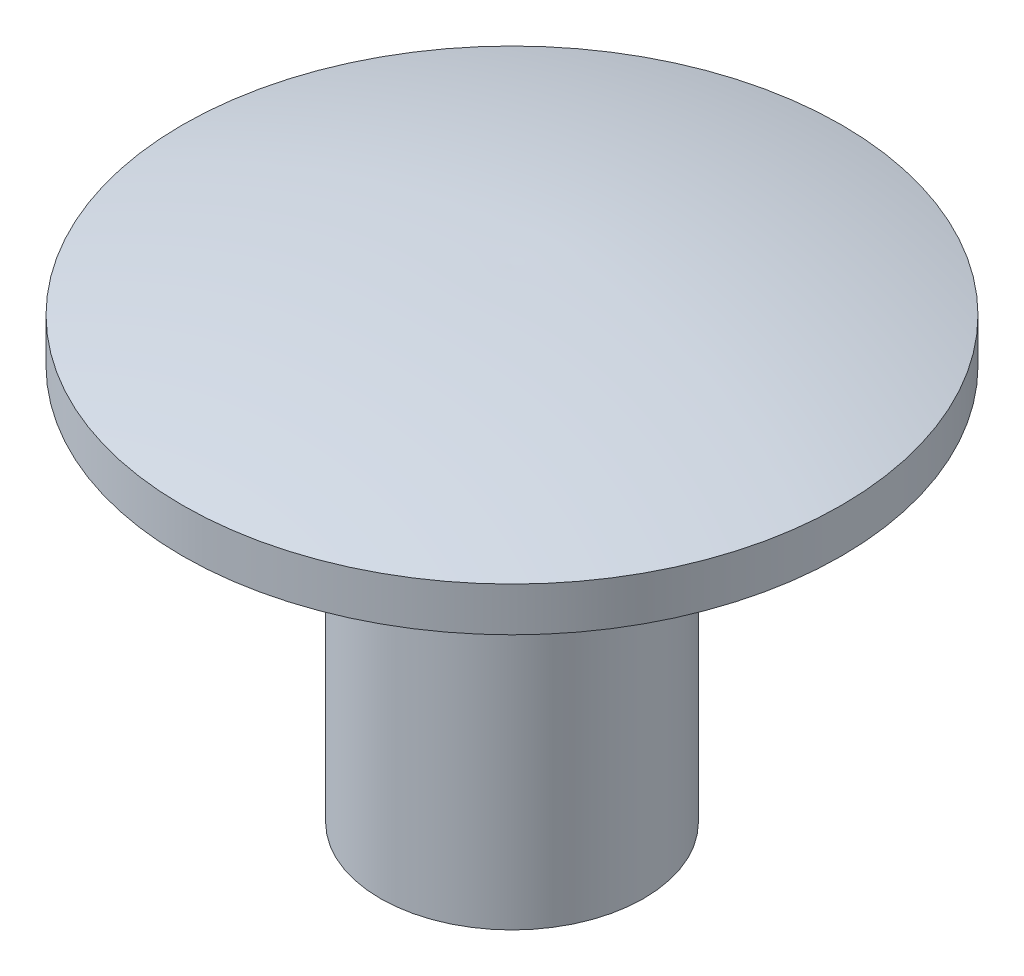
ISO-10303-21;
HEADER;
FILE_DESCRIPTION(('STEP AP214'),'2;1');
FILE_NAME('part.step','',(''),(''),'','','');
FILE_SCHEMA(('AUTOMOTIVE_DESIGN { 1 0 10303 214 1 1 1 1 }'));
ENDSEC;
DATA;
#1=APPLICATION_CONTEXT('core data for automotive mechanical design processes');
#2=APPLICATION_PROTOCOL_DEFINITION('international standard','automotive_design',2000,#1);
#3=PRODUCT_CONTEXT('',#1,'mechanical');
#4=PRODUCT('Part','Part','',(#3));
#5=PRODUCT_RELATED_PRODUCT_CATEGORY('part','',(#4));
#6=PRODUCT_DEFINITION_FORMATION('','',#4);
#7=PRODUCT_DEFINITION_CONTEXT('part definition',#1,'design');
#8=PRODUCT_DEFINITION('design','',#6,#7);
#9=PRODUCT_DEFINITION_SHAPE('','',#8);
#10=(LENGTH_UNIT() NAMED_UNIT(*) SI_UNIT(.MILLI.,.METRE.));
#11=(NAMED_UNIT(*) PLANE_ANGLE_UNIT() SI_UNIT($,.RADIAN.));
#12=(NAMED_UNIT(*) SI_UNIT($,.STERADIAN.) SOLID_ANGLE_UNIT());
#13=UNCERTAINTY_MEASURE_WITH_UNIT(LENGTH_MEASURE(1.E-05),#10,'distance_accuracy_value','');
#14=(GEOMETRIC_REPRESENTATION_CONTEXT(3) GLOBAL_UNCERTAINTY_ASSIGNED_CONTEXT((#13)) GLOBAL_UNIT_ASSIGNED_CONTEXT((#10,
#11,#12)) REPRESENTATION_CONTEXT('',''));
#15=CARTESIAN_POINT('',(0.,0.,0.));
#16=DIRECTION('',(0.,0.,1.));
#17=DIRECTION('',(1.,0.,0.));
#18=AXIS2_PLACEMENT_3D('',#15,#16,#17);
#19=CARTESIAN_POINT('',(0.,-2.,1.11022302462516E-13));
#20=DIRECTION('',(0.,-1.,0.));
#21=DIRECTION('',(0.,0.,-1.));
#22=AXIS2_PLACEMENT_3D('',#19,#20,#21);
#23=PLANE('',#22);
#24=CARTESIAN_POINT('',(0.,-2.,1.11022302462516E-13));
#25=DIRECTION('',(0.,-1.,0.));
#26=DIRECTION('',(0.,0.,-1.));
#27=AXIS2_PLACEMENT_3D('',#24,#25,#26);
#28=CIRCLE('',#27,3.);
#29=CARTESIAN_POINT('',(0.,-2.,-2.99999999999984));
#30=VERTEX_POINT('',#29);
#31=CARTESIAN_POINT('',(3.00000000000003,-2.,1.66533453693773E-13));
#32=VERTEX_POINT('',#31);
#33=EDGE_CURVE('E53',#30,#32,#28,.T.);
#34=ORIENTED_EDGE('',*,*,#33,.F.);
#35=DIRECTION('',(1.,0.,0.));
#36=VECTOR('',#35,1.);
#37=CARTESIAN_POINT('',(-2.99999999999992,-2.,-2.99999999999989));
#38=LINE('',#37,#36);
#39=CARTESIAN_POINT('',(3.00000000000006,-2.,-2.99999999999989));
#40=VERTEX_POINT('',#39);
#41=EDGE_CURVE('E133',#30,#40,#38,.T.);
#42=ORIENTED_EDGE('',*,*,#41,.T.);
#43=DIRECTION('',(0.,0.,1.));
#44=VECTOR('',#43,1.);
#45=CARTESIAN_POINT('',(3.00000000000009,-2.,3.00000000000006));
#46=LINE('',#45,#44);
#47=EDGE_CURVE('E122',#40,#32,#46,.T.);
#48=ORIENTED_EDGE('',*,*,#47,.T.);
#49=EDGE_LOOP('',(#34,#42,#48));
#50=FACE_BOUND('',#49,.T.);
#51=ADVANCED_FACE('F42',(#50),#23,.T.);
#52=CARTESIAN_POINT('',(0.,-2.,3.00000000000011));
#53=VERTEX_POINT('',#52);
#54=EDGE_CURVE('E11',#32,#53,#28,.T.);
#55=ORIENTED_EDGE('',*,*,#54,.F.);
#56=CARTESIAN_POINT('',(3.00000000000009,-2.,3.00000000000006));
#57=VERTEX_POINT('',#56);
#58=EDGE_CURVE('E126',#32,#57,#46,.T.);
#59=ORIENTED_EDGE('',*,*,#58,.T.);
#60=DIRECTION('',(-1.,0.,0.));
#61=VECTOR('',#60,1.);
#62=CARTESIAN_POINT('',(-2.99999999999998,-2.,3.00000000000006));
#63=LINE('',#62,#61);
#64=EDGE_CURVE('E127',#57,#53,#63,.T.);
#65=ORIENTED_EDGE('',*,*,#64,.T.);
#66=EDGE_LOOP('',(#55,#59,#65));
#67=FACE_BOUND('',#66,.T.);
#68=ADVANCED_FACE('F182',(#67),#23,.T.);
#69=CARTESIAN_POINT('',(-2.99999999999998,-2.,1.11022302462516E-13));
#70=VERTEX_POINT('',#69);
#71=EDGE_CURVE('E51',#53,#70,#28,.T.);
#72=ORIENTED_EDGE('',*,*,#71,.F.);
#73=CARTESIAN_POINT('',(-2.99999999999998,-2.,3.00000000000006));
#74=VERTEX_POINT('',#73);
#75=EDGE_CURVE('E125',#53,#74,#63,.T.);
#76=ORIENTED_EDGE('',*,*,#75,.T.);
#77=DIRECTION('',(0.,0.,-1.));
#78=VECTOR('',#77,1.);
#79=CARTESIAN_POINT('',(-2.99999999999998,-2.,3.00000000000006));
#80=LINE('',#79,#78);
#81=EDGE_CURVE('E131',#74,#70,#80,.T.);
#82=ORIENTED_EDGE('',*,*,#81,.T.);
#83=EDGE_LOOP('',(#72,#76,#82));
#84=FACE_BOUND('',#83,.T.);
#85=ADVANCED_FACE('F175',(#84),#23,.T.);
#86=CARTESIAN_POINT('',(0.,0.,0.));
#87=DIRECTION('',(0.,1.,0.));
#88=DIRECTION('',(0.,0.,1.));
#89=AXIS2_PLACEMENT_3D('',#86,#87,#88);
#90=PLANE('',#89);
#91=CARTESIAN_POINT('',(0.,0.,0.));
#92=DIRECTION('',(0.,1.,0.));
#93=DIRECTION('',(0.,0.,1.));
#94=AXIS2_PLACEMENT_3D('',#91,#92,#93);
#95=CIRCLE('',#94,7.5);
#96=CARTESIAN_POINT('',(0.,0.,7.5));
#97=VERTEX_POINT('',#96);
#98=EDGE_CURVE('E46',#97,#97,#95,.T.);
#99=ORIENTED_EDGE('',*,*,#98,.F.);
#100=EDGE_LOOP('',(#99));
#101=FACE_BOUND('',#100,.T.);
#102=DIRECTION('',(0.,0.,1.));
#103=VECTOR('',#102,1.);
#104=CARTESIAN_POINT('',(2.99999999999995,0.,3.00000000000006));
#105=LINE('',#104,#103);
#106=CARTESIAN_POINT('',(3.00000000000003,0.,-3.));
#107=VERTEX_POINT('',#106);
#108=CARTESIAN_POINT('',(2.99999999999995,0.,3.00000000000006));
#109=VERTEX_POINT('',#108);
#110=EDGE_CURVE('E120',#107,#109,#105,.T.);
#111=ORIENTED_EDGE('',*,*,#110,.F.);
#112=DIRECTION('',(1.,0.,0.));
#113=VECTOR('',#112,1.);
#114=CARTESIAN_POINT('',(-3.00000000000006,0.,-2.99999999999989));
#115=LINE('',#114,#113);
#116=CARTESIAN_POINT('',(-3.00000000000006,0.,-2.99999999999989));
#117=VERTEX_POINT('',#116);
#118=EDGE_CURVE('E145',#117,#107,#115,.T.);
#119=ORIENTED_EDGE('',*,*,#118,.F.);
#120=DIRECTION('',(0.,0.,-1.));
#121=VECTOR('',#120,1.);
#122=CARTESIAN_POINT('',(-3.00000000000009,0.,3.));
#123=LINE('',#122,#121);
#124=CARTESIAN_POINT('',(-3.00000000000009,0.,3.));
#125=VERTEX_POINT('',#124);
#126=EDGE_CURVE('E142',#125,#117,#123,.T.);
#127=ORIENTED_EDGE('',*,*,#126,.F.);
#128=DIRECTION('',(-1.,0.,0.));
#129=VECTOR('',#128,1.);
#130=CARTESIAN_POINT('',(-3.00000000000009,0.,3.));
#131=LINE('',#130,#129);
#132=EDGE_CURVE('E139',#109,#125,#131,.T.);
#133=ORIENTED_EDGE('',*,*,#132,.F.);
#134=EDGE_LOOP('',(#111,#119,#127,#133));
#135=FACE_BOUND('',#134,.T.);
#136=ADVANCED_FACE('F173',(#101,#135),#90,.F.);
#137=CARTESIAN_POINT('',(0.,1.,0.));
#138=DIRECTION('',(0.,-1.,0.));
#139=DIRECTION('',(0.,0.,-1.));
#140=AXIS2_PLACEMENT_3D('',#137,#138,#139);
#141=CYLINDRICAL_SURFACE('',#140,7.5);
#142=CARTESIAN_POINT('',(0.,1.,0.));
#143=DIRECTION('',(0.,1.,0.));
#144=DIRECTION('',(0.,0.,1.));
#145=AXIS2_PLACEMENT_3D('',#142,#143,#144);
#146=CIRCLE('',#145,7.5);
#147=CARTESIAN_POINT('',(0.,1.,7.49999999999994));
#148=VERTEX_POINT('',#147);
#149=EDGE_CURVE('E162',#148,#148,#146,.T.);
#150=ORIENTED_EDGE('',*,*,#149,.F.);
#151=EDGE_LOOP('',(#150));
#152=FACE_BOUND('',#151,.T.);
#153=ORIENTED_EDGE('',*,*,#98,.T.);
#154=EDGE_LOOP('',(#153));
#155=FACE_BOUND('',#154,.T.);
#156=ADVANCED_FACE('F44',(#152,#155),#141,.T.);
#157=CARTESIAN_POINT('',(7.50000000000006,1.,0.));
#158=CARTESIAN_POINT('',(3.82280275613323,2.04760619589786,0.));
#159=CARTESIAN_POINT('',(0.,2.,0.));
#160=B_SPLINE_CURVE_WITH_KNOTS('',2,(#157,#158,#159),.UNSPECIFIED.,.F.,.F.,(3,3),(0.,1.),.UNSPECIFIED.);
#161=CARTESIAN_POINT('',(0.,1.,0.));
#162=DIRECTION('',(0.,-1.,0.));
#163=AXIS1_PLACEMENT('',#161,#162);
#164=SURFACE_OF_REVOLUTION('',#160,#163);
#165=CARTESIAN_POINT('',(0.,2.,0.));
#166=VERTEX_POINT('',#165);
#167=VERTEX_LOOP('',#166);
#168=FACE_BOUND('',#167,.T.);
#169=ORIENTED_EDGE('',*,*,#149,.T.);
#170=EDGE_LOOP('',(#169));
#171=FACE_BOUND('',#170,.T.);
#172=ADVANCED_FACE('F167',(#168,#171),#164,.F.);
#173=CARTESIAN_POINT('',(3.00000000000009,-2.,3.00000000000006));
#174=DIRECTION('',(-1.,0.,0.));
#175=DIRECTION('',(0.,0.,1.));
#176=AXIS2_PLACEMENT_3D('',#173,#174,#175);
#177=PLANE('',#176);
#178=ORIENTED_EDGE('',*,*,#110,.T.);
#179=DIRECTION('',(0.,1.,0.));
#180=VECTOR('',#179,1.);
#181=CARTESIAN_POINT('',(3.00000000000009,-2.,3.00000000000006));
#182=LINE('',#181,#180);
#183=EDGE_CURVE('E156',#57,#109,#182,.T.);
#184=ORIENTED_EDGE('',*,*,#183,.F.);
#185=ORIENTED_EDGE('',*,*,#58,.F.);
#186=ORIENTED_EDGE('',*,*,#47,.F.);
#187=DIRECTION('',(0.,1.,0.));
#188=VECTOR('',#187,1.);
#189=CARTESIAN_POINT('',(3.00000000000006,-2.,-2.99999999999989));
#190=LINE('',#189,#188);
#191=EDGE_CURVE('E136',#40,#107,#190,.T.);
#192=ORIENTED_EDGE('',*,*,#191,.T.);
#193=EDGE_LOOP('',(#178,#184,#185,#186,#192));
#194=FACE_BOUND('',#193,.T.);
#195=ADVANCED_FACE('F170',(#194),#177,.F.);
#196=CARTESIAN_POINT('',(-2.99999999999998,-2.,3.00000000000006));
#197=DIRECTION('',(0.,0.,-1.));
#198=DIRECTION('',(-1.,0.,0.));
#199=AXIS2_PLACEMENT_3D('',#196,#197,#198);
#200=PLANE('',#199);
#201=ORIENTED_EDGE('',*,*,#132,.T.);
#202=DIRECTION('',(0.,1.,0.));
#203=VECTOR('',#202,1.);
#204=CARTESIAN_POINT('',(-2.99999999999998,-2.,3.00000000000006));
#205=LINE('',#204,#203);
#206=EDGE_CURVE('E153',#74,#125,#205,.T.);
#207=ORIENTED_EDGE('',*,*,#206,.F.);
#208=ORIENTED_EDGE('',*,*,#75,.F.);
#209=ORIENTED_EDGE('',*,*,#64,.F.);
#210=ORIENTED_EDGE('',*,*,#183,.T.);
#211=EDGE_LOOP('',(#201,#207,#208,#209,#210));
#212=FACE_BOUND('',#211,.T.);
#213=ADVANCED_FACE('F209',(#212),#200,.F.);
#214=CARTESIAN_POINT('',(-2.99999999999998,-2.,3.00000000000006));
#215=DIRECTION('',(1.,0.,0.));
#216=DIRECTION('',(0.,0.,-1.));
#217=AXIS2_PLACEMENT_3D('',#214,#215,#216);
#218=PLANE('',#217);
#219=ORIENTED_EDGE('',*,*,#126,.T.);
#220=DIRECTION('',(0.,1.,0.));
#221=VECTOR('',#220,1.);
#222=CARTESIAN_POINT('',(-2.99999999999992,-2.,-2.99999999999989));
#223=LINE('',#222,#221);
#224=CARTESIAN_POINT('',(-2.99999999999992,-2.,-2.99999999999989));
#225=VERTEX_POINT('',#224);
#226=EDGE_CURVE('E150',#225,#117,#223,.T.);
#227=ORIENTED_EDGE('',*,*,#226,.F.);
#228=EDGE_CURVE('E130',#70,#225,#80,.T.);
#229=ORIENTED_EDGE('',*,*,#228,.F.);
#230=ORIENTED_EDGE('',*,*,#81,.F.);
#231=ORIENTED_EDGE('',*,*,#206,.T.);
#232=EDGE_LOOP('',(#219,#227,#229,#230,#231));
#233=FACE_BOUND('',#232,.T.);
#234=ADVANCED_FACE('F204',(#233),#218,.F.);
#235=CARTESIAN_POINT('',(-2.99999999999992,-2.,-2.99999999999989));
#236=DIRECTION('',(0.,0.,1.));
#237=DIRECTION('',(1.,0.,0.));
#238=AXIS2_PLACEMENT_3D('',#235,#236,#237);
#239=PLANE('',#238);
#240=ORIENTED_EDGE('',*,*,#118,.T.);
#241=ORIENTED_EDGE('',*,*,#191,.F.);
#242=ORIENTED_EDGE('',*,*,#41,.F.);
#243=EDGE_CURVE('E134',#225,#30,#38,.T.);
#244=ORIENTED_EDGE('',*,*,#243,.F.);
#245=ORIENTED_EDGE('',*,*,#226,.T.);
#246=EDGE_LOOP('',(#240,#241,#242,#244,#245));
#247=FACE_BOUND('',#246,.T.);
#248=ADVANCED_FACE('F198',(#247),#239,.F.);
#249=EDGE_CURVE('E60',#70,#30,#28,.T.);
#250=ORIENTED_EDGE('',*,*,#249,.F.);
#251=ORIENTED_EDGE('',*,*,#228,.T.);
#252=ORIENTED_EDGE('',*,*,#243,.T.);
#253=EDGE_LOOP('',(#250,#251,#252));
#254=FACE_BOUND('',#253,.T.);
#255=ADVANCED_FACE('F184',(#254),#23,.T.);
#256=CARTESIAN_POINT('',(0.,-9.,0.));
#257=DIRECTION('',(0.,1.,0.));
#258=DIRECTION('',(0.,0.,1.));
#259=AXIS2_PLACEMENT_3D('',#256,#257,#258);
#260=CYLINDRICAL_SURFACE('',#259,3.);
#261=CARTESIAN_POINT('',(0.,-9.,0.));
#262=DIRECTION('',(0.,-1.,0.));
#263=DIRECTION('',(0.,0.,-1.));
#264=AXIS2_PLACEMENT_3D('',#261,#262,#263);
#265=CIRCLE('',#264,3.);
#266=CARTESIAN_POINT('',(0.,-9.,-3.));
#267=VERTEX_POINT('',#266);
#268=EDGE_CURVE('E115',#267,#267,#265,.T.);
#269=ORIENTED_EDGE('',*,*,#268,.F.);
#270=EDGE_LOOP('',(#269));
#271=FACE_BOUND('',#270,.T.);
#272=ORIENTED_EDGE('',*,*,#33,.T.);
#273=ORIENTED_EDGE('',*,*,#54,.T.);
#274=ORIENTED_EDGE('',*,*,#71,.T.);
#275=ORIENTED_EDGE('',*,*,#249,.T.);
#276=EDGE_LOOP('',(#272,#273,#274,#275));
#277=FACE_BOUND('',#276,.T.);
#278=ADVANCED_FACE('F197',(#271,#277),#260,.T.);
#279=CARTESIAN_POINT('',(0.,-9.,0.));
#280=DIRECTION('',(0.,-1.,0.));
#281=DIRECTION('',(0.,0.,-1.));
#282=AXIS2_PLACEMENT_3D('',#279,#280,#281);
#283=PLANE('',#282);
#284=CARTESIAN_POINT('',(0.,-9.,0.));
#285=DIRECTION('',(0.,-1.,0.));
#286=DIRECTION('',(0.,0.,-1.));
#287=AXIS2_PLACEMENT_3D('',#284,#285,#286);
#288=CIRCLE('',#287,2.1);
#289=CARTESIAN_POINT('',(0.,-9.,-2.1));
#290=VERTEX_POINT('',#289);
#291=EDGE_CURVE('E112',#290,#290,#288,.T.);
#292=ORIENTED_EDGE('',*,*,#291,.F.);
#293=EDGE_LOOP('',(#292));
#294=FACE_BOUND('',#293,.T.);
#295=ORIENTED_EDGE('',*,*,#268,.T.);
#296=EDGE_LOOP('',(#295));
#297=FACE_BOUND('',#296,.T.);
#298=ADVANCED_FACE('F106',(#294,#297),#283,.T.);
#299=CARTESIAN_POINT('',(0.,-2.,1.11022302462516E-13));
#300=DIRECTION('',(0.,-1.,0.));
#301=DIRECTION('',(0.,0.,-1.));
#302=AXIS2_PLACEMENT_3D('',#299,#300,#301);
#303=CONICAL_SURFACE('',#302,2.1,1.02974425867665);
#304=CARTESIAN_POINT('',(0.,-0.738192700042124,0.));
#305=VERTEX_POINT('',#304);
#306=VERTEX_LOOP('',#305);
#307=FACE_BOUND('',#306,.T.);
#308=CARTESIAN_POINT('',(0.,-2.,1.11022302462516E-13));
#309=DIRECTION('',(0.,-1.,0.));
#310=DIRECTION('',(0.,0.,-1.));
#311=AXIS2_PLACEMENT_3D('',#308,#309,#310);
#312=CIRCLE('',#311,2.1);
#313=CARTESIAN_POINT('',(0.,-2.,-2.09999999999989));
#314=VERTEX_POINT('',#313);
#315=EDGE_CURVE('E110',#314,#314,#312,.T.);
#316=ORIENTED_EDGE('',*,*,#315,.T.);
#317=EDGE_LOOP('',(#316));
#318=FACE_BOUND('',#317,.T.);
#319=ADVANCED_FACE('F102',(#307,#318),#303,.F.);
#320=CARTESIAN_POINT('',(0.,-9.,0.));
#321=DIRECTION('',(0.,-1.,0.));
#322=DIRECTION('',(0.,0.,-1.));
#323=AXIS2_PLACEMENT_3D('',#320,#321,#322);
#324=CYLINDRICAL_SURFACE('',#323,2.1);
#325=ORIENTED_EDGE('',*,*,#315,.F.);
#326=EDGE_LOOP('',(#325));
#327=FACE_BOUND('',#326,.T.);
#328=ORIENTED_EDGE('',*,*,#291,.T.);
#329=EDGE_LOOP('',(#328));
#330=FACE_BOUND('',#329,.T.);
#331=ADVANCED_FACE('F105',(#327,#330),#324,.F.);
#332=CLOSED_SHELL('',(#51,#68,#85,#136,#156,#172,#195,#213,#234,#248,#255,#278,#298,#319,#331));
#333=MANIFOLD_SOLID_BREP('B2',#332);
#334=ADVANCED_BREP_SHAPE_REPRESENTATION('',(#18,#333),#14);
#335=SHAPE_DEFINITION_REPRESENTATION(#9,#334);
ENDSEC;
END-ISO-10303-21;
